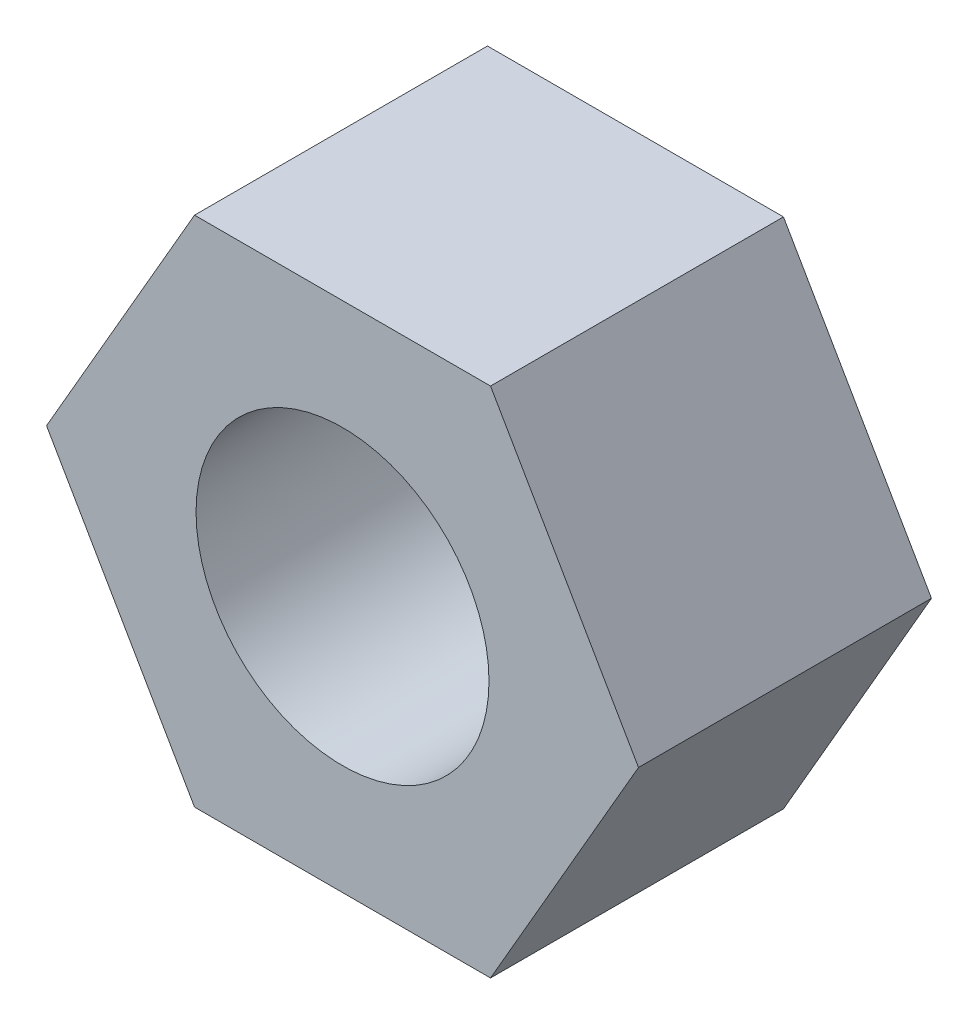
ISO-10303-21;
HEADER;
FILE_DESCRIPTION(('STEP AP214'),'2;1');
FILE_NAME('part.step','',(''),(''),'','','');
FILE_SCHEMA(('AUTOMOTIVE_DESIGN { 1 0 10303 214 1 1 1 1 }'));
ENDSEC;
DATA;
#1=APPLICATION_CONTEXT('core data for automotive mechanical design processes');
#2=APPLICATION_PROTOCOL_DEFINITION('international standard','automotive_design',2000,#1);
#3=PRODUCT_CONTEXT('',#1,'mechanical');
#4=PRODUCT('Part','Part','',(#3));
#5=PRODUCT_RELATED_PRODUCT_CATEGORY('part','',(#4));
#6=PRODUCT_DEFINITION_FORMATION('','',#4);
#7=PRODUCT_DEFINITION_CONTEXT('part definition',#1,'design');
#8=PRODUCT_DEFINITION('design','',#6,#7);
#9=PRODUCT_DEFINITION_SHAPE('','',#8);
#10=(LENGTH_UNIT() NAMED_UNIT(*) SI_UNIT(.MILLI.,.METRE.));
#11=(NAMED_UNIT(*) PLANE_ANGLE_UNIT() SI_UNIT($,.RADIAN.));
#12=(NAMED_UNIT(*) SI_UNIT($,.STERADIAN.) SOLID_ANGLE_UNIT());
#13=UNCERTAINTY_MEASURE_WITH_UNIT(LENGTH_MEASURE(1.E-05),#10,'distance_accuracy_value','');
#14=(GEOMETRIC_REPRESENTATION_CONTEXT(3) GLOBAL_UNCERTAINTY_ASSIGNED_CONTEXT((#13)) GLOBAL_UNIT_ASSIGNED_CONTEXT((#10,
#11,#12)) REPRESENTATION_CONTEXT('',''));
#15=CARTESIAN_POINT('',(0.,0.,0.));
#16=DIRECTION('',(0.,0.,1.));
#17=DIRECTION('',(1.,0.,0.));
#18=AXIS2_PLACEMENT_3D('',#15,#16,#17);
#19=CARTESIAN_POINT('',(0.,0.,12.7));
#20=DIRECTION('',(0.,0.,1.));
#21=DIRECTION('',(1.,0.,0.));
#22=AXIS2_PLACEMENT_3D('',#19,#20,#21);
#23=PLANE('',#22);
#24=DIRECTION('',(1.,0.,0.));
#25=VECTOR('',#24,1.);
#26=CARTESIAN_POINT('',(-6.41580486636972,-11.1125,12.7));
#27=LINE('',#26,#25);
#28=CARTESIAN_POINT('',(-6.41580486636972,-11.1125,12.7));
#29=VERTEX_POINT('',#28);
#30=CARTESIAN_POINT('',(6.41580486636971,-11.1125,12.7));
#31=VERTEX_POINT('',#30);
#32=EDGE_CURVE('E129',#29,#31,#27,.T.);
#33=ORIENTED_EDGE('',*,*,#32,.T.);
#34=DIRECTION('',(0.5,0.866025403784438,0.));
#35=VECTOR('',#34,1.);
#36=CARTESIAN_POINT('',(6.41580486636971,-11.1125,12.7));
#37=LINE('',#36,#35);
#38=CARTESIAN_POINT('',(12.8316097327394,0.,12.7));
#39=VERTEX_POINT('',#38);
#40=EDGE_CURVE('E87',#31,#39,#37,.T.);
#41=ORIENTED_EDGE('',*,*,#40,.T.);
#42=DIRECTION('',(-0.5,0.866025403784439,0.));
#43=VECTOR('',#42,1.);
#44=CARTESIAN_POINT('',(12.8316097327394,0.,12.7));
#45=LINE('',#44,#43);
#46=CARTESIAN_POINT('',(6.41580486636971,11.1125,12.7));
#47=VERTEX_POINT('',#46);
#48=EDGE_CURVE('E100',#39,#47,#45,.T.);
#49=ORIENTED_EDGE('',*,*,#48,.T.);
#50=DIRECTION('',(-1.,0.,0.));
#51=VECTOR('',#50,1.);
#52=CARTESIAN_POINT('',(6.41580486636971,11.1125,12.7));
#53=LINE('',#52,#51);
#54=CARTESIAN_POINT('',(-6.41580486636972,11.1125,12.7));
#55=VERTEX_POINT('',#54);
#56=EDGE_CURVE('E94',#47,#55,#53,.T.);
#57=ORIENTED_EDGE('',*,*,#56,.T.);
#58=DIRECTION('',(-0.5,-0.866025403784438,0.));
#59=VECTOR('',#58,1.);
#60=CARTESIAN_POINT('',(-6.41580486636972,11.1125,12.7));
#61=LINE('',#60,#59);
#62=CARTESIAN_POINT('',(-12.8316097327394,0.,12.7));
#63=VERTEX_POINT('',#62);
#64=EDGE_CURVE('E98',#55,#63,#61,.T.);
#65=ORIENTED_EDGE('',*,*,#64,.T.);
#66=DIRECTION('',(0.5,-0.866025403784439,0.));
#67=VECTOR('',#66,1.);
#68=CARTESIAN_POINT('',(-12.8316097327394,0.,12.7));
#69=LINE('',#68,#67);
#70=EDGE_CURVE('E50',#63,#29,#69,.T.);
#71=ORIENTED_EDGE('',*,*,#70,.T.);
#72=EDGE_LOOP('',(#33,#41,#49,#57,#65,#71));
#73=FACE_BOUND('',#72,.T.);
#74=CARTESIAN_POINT('',(0.,0.,12.7));
#75=DIRECTION('',(0.,0.,1.));
#76=DIRECTION('',(1.,0.,0.));
#77=AXIS2_PLACEMENT_3D('',#74,#75,#76);
#78=CIRCLE('',#77,6.35);
#79=CARTESIAN_POINT('',(6.35,0.,12.7));
#80=VERTEX_POINT('',#79);
#81=EDGE_CURVE('E122',#80,#80,#78,.T.);
#82=ORIENTED_EDGE('',*,*,#81,.F.);
#83=EDGE_LOOP('',(#82));
#84=FACE_BOUND('',#83,.T.);
#85=ADVANCED_FACE('F33',(#73,#84),#23,.T.);
#86=CARTESIAN_POINT('',(0.,0.,0.));
#87=DIRECTION('',(0.,0.,1.));
#88=DIRECTION('',(1.,0.,0.));
#89=AXIS2_PLACEMENT_3D('',#86,#87,#88);
#90=PLANE('',#89);
#91=DIRECTION('',(1.,0.,0.));
#92=VECTOR('',#91,1.);
#93=CARTESIAN_POINT('',(-6.41580486636972,-11.1125,0.));
#94=LINE('',#93,#92);
#95=CARTESIAN_POINT('',(-6.41580486636972,-11.1125,0.));
#96=VERTEX_POINT('',#95);
#97=CARTESIAN_POINT('',(6.41580486636971,-11.1125,0.));
#98=VERTEX_POINT('',#97);
#99=EDGE_CURVE('E118',#96,#98,#94,.T.);
#100=ORIENTED_EDGE('',*,*,#99,.F.);
#101=DIRECTION('',(0.5,-0.866025403784439,0.));
#102=VECTOR('',#101,1.);
#103=CARTESIAN_POINT('',(-12.8316097327394,0.,0.));
#104=LINE('',#103,#102);
#105=CARTESIAN_POINT('',(-12.8316097327394,0.,0.));
#106=VERTEX_POINT('',#105);
#107=EDGE_CURVE('E79',#106,#96,#104,.T.);
#108=ORIENTED_EDGE('',*,*,#107,.F.);
#109=DIRECTION('',(-0.5,-0.866025403784438,0.));
#110=VECTOR('',#109,1.);
#111=CARTESIAN_POINT('',(-6.41580486636972,11.1125,0.));
#112=LINE('',#111,#110);
#113=CARTESIAN_POINT('',(-6.41580486636972,11.1125,0.));
#114=VERTEX_POINT('',#113);
#115=EDGE_CURVE('E73',#114,#106,#112,.T.);
#116=ORIENTED_EDGE('',*,*,#115,.F.);
#117=DIRECTION('',(-1.,0.,0.));
#118=VECTOR('',#117,1.);
#119=CARTESIAN_POINT('',(6.41580486636971,11.1125,0.));
#120=LINE('',#119,#118);
#121=CARTESIAN_POINT('',(6.41580486636971,11.1125,0.));
#122=VERTEX_POINT('',#121);
#123=EDGE_CURVE('E108',#122,#114,#120,.T.);
#124=ORIENTED_EDGE('',*,*,#123,.F.);
#125=DIRECTION('',(-0.5,0.866025403784439,0.));
#126=VECTOR('',#125,1.);
#127=CARTESIAN_POINT('',(12.8316097327394,0.,0.));
#128=LINE('',#127,#126);
#129=CARTESIAN_POINT('',(12.8316097327394,0.,0.));
#130=VERTEX_POINT('',#129);
#131=EDGE_CURVE('E124',#130,#122,#128,.T.);
#132=ORIENTED_EDGE('',*,*,#131,.F.);
#133=DIRECTION('',(0.5,0.866025403784438,0.));
#134=VECTOR('',#133,1.);
#135=CARTESIAN_POINT('',(6.41580486636971,-11.1125,0.));
#136=LINE('',#135,#134);
#137=EDGE_CURVE('E121',#98,#130,#136,.T.);
#138=ORIENTED_EDGE('',*,*,#137,.F.);
#139=EDGE_LOOP('',(#100,#108,#116,#124,#132,#138));
#140=FACE_BOUND('',#139,.T.);
#141=CARTESIAN_POINT('',(0.,0.,0.));
#142=DIRECTION('',(0.,0.,1.));
#143=DIRECTION('',(1.,0.,0.));
#144=AXIS2_PLACEMENT_3D('',#141,#142,#143);
#145=CIRCLE('',#144,6.35);
#146=CARTESIAN_POINT('',(6.35,0.,0.));
#147=VERTEX_POINT('',#146);
#148=EDGE_CURVE('E222',#147,#147,#145,.T.);
#149=ORIENTED_EDGE('',*,*,#148,.T.);
#150=EDGE_LOOP('',(#149));
#151=FACE_BOUND('',#150,.T.);
#152=ADVANCED_FACE('F138',(#140,#151),#90,.F.);
#153=CARTESIAN_POINT('',(-6.41580486636972,-11.1125,12.7));
#154=DIRECTION('',(0.,1.,0.));
#155=DIRECTION('',(-1.,0.,0.));
#156=AXIS2_PLACEMENT_3D('',#153,#154,#155);
#157=PLANE('',#156);
#158=ORIENTED_EDGE('',*,*,#99,.T.);
#159=DIRECTION('',(0.,0.,-1.));
#160=VECTOR('',#159,1.);
#161=CARTESIAN_POINT('',(6.41580486636971,-11.1125,12.7));
#162=LINE('',#161,#160);
#163=EDGE_CURVE('E11',#31,#98,#162,.T.);
#164=ORIENTED_EDGE('',*,*,#163,.F.);
#165=ORIENTED_EDGE('',*,*,#32,.F.);
#166=DIRECTION('',(0.,0.,-1.));
#167=VECTOR('',#166,1.);
#168=CARTESIAN_POINT('',(-6.41580486636972,-11.1125,12.7));
#169=LINE('',#168,#167);
#170=EDGE_CURVE('E114',#29,#96,#169,.T.);
#171=ORIENTED_EDGE('',*,*,#170,.T.);
#172=EDGE_LOOP('',(#158,#164,#165,#171));
#173=FACE_BOUND('',#172,.T.);
#174=ADVANCED_FACE('F35',(#173),#157,.F.);
#175=CARTESIAN_POINT('',(6.41580486636971,-11.1125,12.7));
#176=DIRECTION('',(-0.866025403784438,0.5,0.));
#177=DIRECTION('',(-0.5,-0.866025403784439,0.));
#178=AXIS2_PLACEMENT_3D('',#175,#176,#177);
#179=PLANE('',#178);
#180=ORIENTED_EDGE('',*,*,#137,.T.);
#181=DIRECTION('',(0.,0.,-1.));
#182=VECTOR('',#181,1.);
#183=CARTESIAN_POINT('',(12.8316097327394,0.,12.7));
#184=LINE('',#183,#182);
#185=EDGE_CURVE('E42',#39,#130,#184,.T.);
#186=ORIENTED_EDGE('',*,*,#185,.F.);
#187=ORIENTED_EDGE('',*,*,#40,.F.);
#188=ORIENTED_EDGE('',*,*,#163,.T.);
#189=EDGE_LOOP('',(#180,#186,#187,#188));
#190=FACE_BOUND('',#189,.T.);
#191=ADVANCED_FACE('F163',(#190),#179,.F.);
#192=CARTESIAN_POINT('',(12.8316097327394,0.,12.7));
#193=DIRECTION('',(-0.866025403784439,-0.5,0.));
#194=DIRECTION('',(0.5,-0.866025403784439,0.));
#195=AXIS2_PLACEMENT_3D('',#192,#193,#194);
#196=PLANE('',#195);
#197=ORIENTED_EDGE('',*,*,#131,.T.);
#198=DIRECTION('',(0.,0.,-1.));
#199=VECTOR('',#198,1.);
#200=CARTESIAN_POINT('',(6.41580486636971,11.1125,12.7));
#201=LINE('',#200,#199);
#202=EDGE_CURVE('E109',#47,#122,#201,.T.);
#203=ORIENTED_EDGE('',*,*,#202,.F.);
#204=ORIENTED_EDGE('',*,*,#48,.F.);
#205=ORIENTED_EDGE('',*,*,#185,.T.);
#206=EDGE_LOOP('',(#197,#203,#204,#205));
#207=FACE_BOUND('',#206,.T.);
#208=ADVANCED_FACE('F135',(#207),#196,.F.);
#209=CARTESIAN_POINT('',(6.41580486636971,11.1125,12.7));
#210=DIRECTION('',(0.,-1.,0.));
#211=DIRECTION('',(0.,0.,-1.));
#212=AXIS2_PLACEMENT_3D('',#209,#210,#211);
#213=PLANE('',#212);
#214=ORIENTED_EDGE('',*,*,#123,.T.);
#215=DIRECTION('',(0.,0.,-1.));
#216=VECTOR('',#215,1.);
#217=CARTESIAN_POINT('',(-6.41580486636972,11.1125,12.7));
#218=LINE('',#217,#216);
#219=EDGE_CURVE('E105',#55,#114,#218,.T.);
#220=ORIENTED_EDGE('',*,*,#219,.F.);
#221=ORIENTED_EDGE('',*,*,#56,.F.);
#222=ORIENTED_EDGE('',*,*,#202,.T.);
#223=EDGE_LOOP('',(#214,#220,#221,#222));
#224=FACE_BOUND('',#223,.T.);
#225=ADVANCED_FACE('F106',(#224),#213,.F.);
#226=CARTESIAN_POINT('',(-6.41580486636972,11.1125,12.7));
#227=DIRECTION('',(0.866025403784438,-0.5,0.));
#228=DIRECTION('',(0.5,0.866025403784439,0.));
#229=AXIS2_PLACEMENT_3D('',#226,#227,#228);
#230=PLANE('',#229);
#231=ORIENTED_EDGE('',*,*,#115,.T.);
#232=DIRECTION('',(0.,0.,-1.));
#233=VECTOR('',#232,1.);
#234=CARTESIAN_POINT('',(-12.8316097327394,0.,12.7));
#235=LINE('',#234,#233);
#236=EDGE_CURVE('E110',#63,#106,#235,.T.);
#237=ORIENTED_EDGE('',*,*,#236,.F.);
#238=ORIENTED_EDGE('',*,*,#64,.F.);
#239=ORIENTED_EDGE('',*,*,#219,.T.);
#240=EDGE_LOOP('',(#231,#237,#238,#239));
#241=FACE_BOUND('',#240,.T.);
#242=ADVANCED_FACE('F112',(#241),#230,.F.);
#243=CARTESIAN_POINT('',(-12.8316097327394,0.,12.7));
#244=DIRECTION('',(0.866025403784439,0.5,0.));
#245=DIRECTION('',(-0.5,0.866025403784439,0.));
#246=AXIS2_PLACEMENT_3D('',#243,#244,#245);
#247=PLANE('',#246);
#248=ORIENTED_EDGE('',*,*,#107,.T.);
#249=ORIENTED_EDGE('',*,*,#170,.F.);
#250=ORIENTED_EDGE('',*,*,#70,.F.);
#251=ORIENTED_EDGE('',*,*,#236,.T.);
#252=EDGE_LOOP('',(#248,#249,#250,#251));
#253=FACE_BOUND('',#252,.T.);
#254=ADVANCED_FACE('F143',(#253),#247,.F.);
#255=CARTESIAN_POINT('',(0.,0.,12.7));
#256=DIRECTION('',(0.,0.,-1.));
#257=DIRECTION('',(-1.,0.,0.));
#258=AXIS2_PLACEMENT_3D('',#255,#256,#257);
#259=CYLINDRICAL_SURFACE('',#258,6.35);
#260=ORIENTED_EDGE('',*,*,#81,.T.);
#261=EDGE_LOOP('',(#260));
#262=FACE_BOUND('',#261,.T.);
#263=ORIENTED_EDGE('',*,*,#148,.F.);
#264=EDGE_LOOP('',(#263));
#265=FACE_BOUND('',#264,.T.);
#266=ADVANCED_FACE('F145',(#262,#265),#259,.F.);
#267=CLOSED_SHELL('',(#85,#152,#174,#191,#208,#225,#242,#254,#266));
#268=MANIFOLD_SOLID_BREP('B2',#267);
#269=ADVANCED_BREP_SHAPE_REPRESENTATION('',(#18,#268),#14);
#270=SHAPE_DEFINITION_REPRESENTATION(#9,#269);
ENDSEC;
END-ISO-10303-21;
